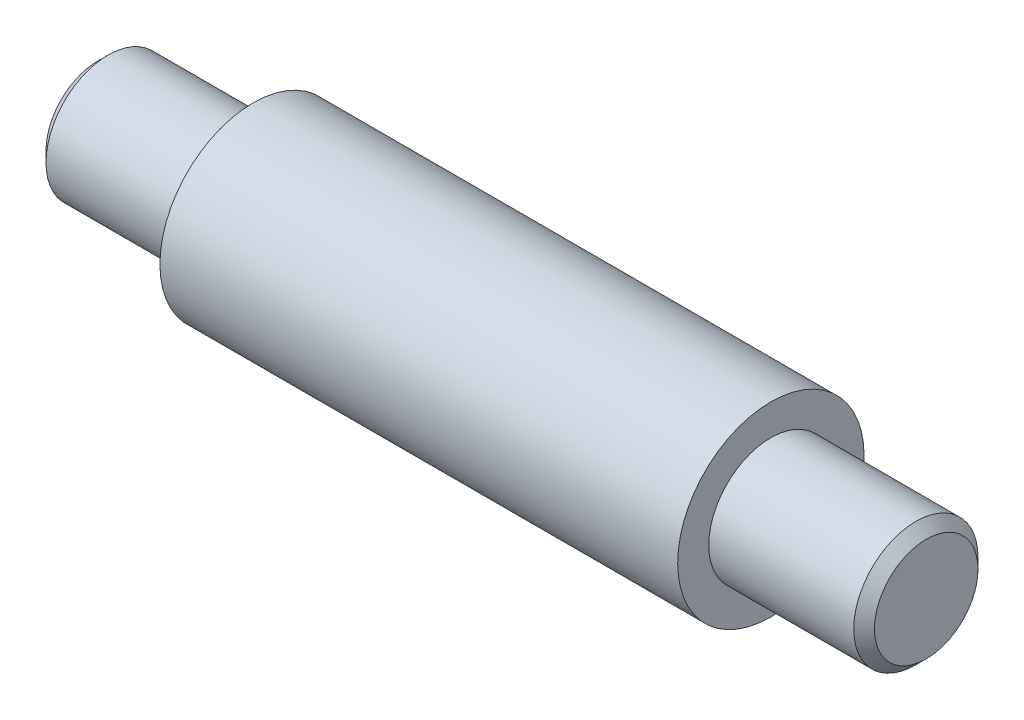
ISO-10303-21;
HEADER;
FILE_DESCRIPTION(('STEP AP214'),'2;1');
FILE_NAME('part.step','',(''),(''),'','','');
FILE_SCHEMA(('AUTOMOTIVE_DESIGN { 1 0 10303 214 1 1 1 1 }'));
ENDSEC;
DATA;
#1=APPLICATION_CONTEXT('core data for automotive mechanical design processes');
#2=APPLICATION_PROTOCOL_DEFINITION('international standard','automotive_design',2000,#1);
#3=PRODUCT_CONTEXT('',#1,'mechanical');
#4=PRODUCT('Part','Part','',(#3));
#5=PRODUCT_RELATED_PRODUCT_CATEGORY('part','',(#4));
#6=PRODUCT_DEFINITION_FORMATION('','',#4);
#7=PRODUCT_DEFINITION_CONTEXT('part definition',#1,'design');
#8=PRODUCT_DEFINITION('design','',#6,#7);
#9=PRODUCT_DEFINITION_SHAPE('','',#8);
#10=(LENGTH_UNIT() NAMED_UNIT(*) SI_UNIT(.MILLI.,.METRE.));
#11=(NAMED_UNIT(*) PLANE_ANGLE_UNIT() SI_UNIT($,.RADIAN.));
#12=(NAMED_UNIT(*) SI_UNIT($,.STERADIAN.) SOLID_ANGLE_UNIT());
#13=UNCERTAINTY_MEASURE_WITH_UNIT(LENGTH_MEASURE(1.E-05),#10,'distance_accuracy_value','');
#14=(GEOMETRIC_REPRESENTATION_CONTEXT(3) GLOBAL_UNCERTAINTY_ASSIGNED_CONTEXT((#13)) GLOBAL_UNIT_ASSIGNED_CONTEXT((#10,
#11,#12)) REPRESENTATION_CONTEXT('',''));
#15=CARTESIAN_POINT('',(0.,0.,0.));
#16=DIRECTION('',(0.,0.,1.));
#17=DIRECTION('',(1.,0.,0.));
#18=AXIS2_PLACEMENT_3D('',#15,#16,#17);
#19=CARTESIAN_POINT('',(-40.,0.,0.));
#20=DIRECTION('',(-1.,0.,0.));
#21=DIRECTION('',(0.,0.,1.));
#22=AXIS2_PLACEMENT_3D('',#19,#20,#21);
#23=PLANE('',#22);
#24=CARTESIAN_POINT('',(-40.,0.,0.));
#25=DIRECTION('',(-1.,0.,0.));
#26=DIRECTION('',(0.,0.,1.));
#27=AXIS2_PLACEMENT_3D('',#24,#25,#26);
#28=CIRCLE('',#27,5.);
#29=CARTESIAN_POINT('',(-40.,0.,5.));
#30=VERTEX_POINT('',#29);
#31=EDGE_CURVE('E51',#30,#30,#28,.T.);
#32=ORIENTED_EDGE('',*,*,#31,.T.);
#33=EDGE_LOOP('',(#32));
#34=FACE_BOUND('',#33,.T.);
#35=ADVANCED_FACE('F43',(#34),#23,.T.);
#36=CARTESIAN_POINT('',(-40.,0.,0.));
#37=DIRECTION('',(-1.,0.,0.));
#38=DIRECTION('',(0.,0.,1.));
#39=AXIS2_PLACEMENT_3D('',#36,#37,#38);
#40=CYLINDRICAL_SURFACE('',#39,6.);
#41=CARTESIAN_POINT('',(-39.,0.,0.));
#42=DIRECTION('',(-1.,0.,0.));
#43=DIRECTION('',(0.,0.,1.));
#44=AXIS2_PLACEMENT_3D('',#41,#42,#43);
#45=CIRCLE('',#44,6.);
#46=CARTESIAN_POINT('',(-39.,0.,6.));
#47=VERTEX_POINT('',#46);
#48=EDGE_CURVE('E10',#47,#47,#45,.F.);
#49=ORIENTED_EDGE('',*,*,#48,.T.);
#50=EDGE_LOOP('',(#49));
#51=FACE_BOUND('',#50,.T.);
#52=CARTESIAN_POINT('',(-25.,0.,0.));
#53=DIRECTION('',(-1.,0.,0.));
#54=DIRECTION('',(0.,0.,1.));
#55=AXIS2_PLACEMENT_3D('',#52,#53,#54);
#56=CIRCLE('',#55,6.);
#57=CARTESIAN_POINT('',(-25.,0.,6.));
#58=VERTEX_POINT('',#57);
#59=EDGE_CURVE('E61',#58,#58,#56,.T.);
#60=ORIENTED_EDGE('',*,*,#59,.T.);
#61=EDGE_LOOP('',(#60));
#62=FACE_BOUND('',#61,.T.);
#63=ADVANCED_FACE('F92',(#51,#62),#40,.T.);
#64=CARTESIAN_POINT('',(-25.,6.,0.));
#65=DIRECTION('',(-1.,0.,0.));
#66=DIRECTION('',(0.,0.,1.));
#67=AXIS2_PLACEMENT_3D('',#64,#65,#66);
#68=PLANE('',#67);
#69=CARTESIAN_POINT('',(-25.,0.,0.));
#70=DIRECTION('',(-1.,0.,0.));
#71=DIRECTION('',(0.,0.,1.));
#72=AXIS2_PLACEMENT_3D('',#69,#70,#71);
#73=CIRCLE('',#72,9.);
#74=CARTESIAN_POINT('',(-25.,0.,9.));
#75=VERTEX_POINT('',#74);
#76=EDGE_CURVE('E70',#75,#75,#73,.T.);
#77=ORIENTED_EDGE('',*,*,#76,.T.);
#78=EDGE_LOOP('',(#77));
#79=FACE_BOUND('',#78,.T.);
#80=ORIENTED_EDGE('',*,*,#59,.F.);
#81=EDGE_LOOP('',(#80));
#82=FACE_BOUND('',#81,.T.);
#83=ADVANCED_FACE('F99',(#79,#82),#68,.T.);
#84=CARTESIAN_POINT('',(-40.,0.,0.));
#85=DIRECTION('',(-1.,0.,0.));
#86=DIRECTION('',(0.,0.,1.));
#87=AXIS2_PLACEMENT_3D('',#84,#85,#86);
#88=CYLINDRICAL_SURFACE('',#87,9.);
#89=CARTESIAN_POINT('',(25.,0.,0.));
#90=DIRECTION('',(-1.,0.,0.));
#91=DIRECTION('',(0.,0.,1.));
#92=AXIS2_PLACEMENT_3D('',#89,#90,#91);
#93=CIRCLE('',#92,9.);
#94=CARTESIAN_POINT('',(25.,0.,9.));
#95=VERTEX_POINT('',#94);
#96=EDGE_CURVE('E68',#95,#95,#93,.T.);
#97=ORIENTED_EDGE('',*,*,#96,.T.);
#98=EDGE_LOOP('',(#97));
#99=FACE_BOUND('',#98,.T.);
#100=ORIENTED_EDGE('',*,*,#76,.F.);
#101=EDGE_LOOP('',(#100));
#102=FACE_BOUND('',#101,.T.);
#103=ADVANCED_FACE('F95',(#99,#102),#88,.T.);
#104=CARTESIAN_POINT('',(25.,9.,0.));
#105=DIRECTION('',(1.,0.,0.));
#106=DIRECTION('',(0.,0.,-1.));
#107=AXIS2_PLACEMENT_3D('',#104,#105,#106);
#108=PLANE('',#107);
#109=CARTESIAN_POINT('',(25.,0.,0.));
#110=DIRECTION('',(-1.,0.,0.));
#111=DIRECTION('',(0.,0.,1.));
#112=AXIS2_PLACEMENT_3D('',#109,#110,#111);
#113=CIRCLE('',#112,6.);
#114=CARTESIAN_POINT('',(25.,0.,6.));
#115=VERTEX_POINT('',#114);
#116=EDGE_CURVE('E71',#115,#115,#113,.T.);
#117=ORIENTED_EDGE('',*,*,#116,.T.);
#118=EDGE_LOOP('',(#117));
#119=FACE_BOUND('',#118,.T.);
#120=ORIENTED_EDGE('',*,*,#96,.F.);
#121=EDGE_LOOP('',(#120));
#122=FACE_BOUND('',#121,.T.);
#123=ADVANCED_FACE('F80',(#119,#122),#108,.T.);
#124=CARTESIAN_POINT('',(-40.,0.,0.));
#125=DIRECTION('',(-1.,0.,0.));
#126=DIRECTION('',(0.,0.,1.));
#127=AXIS2_PLACEMENT_3D('',#124,#125,#126);
#128=CYLINDRICAL_SURFACE('',#127,6.);
#129=CARTESIAN_POINT('',(39.,0.,0.));
#130=DIRECTION('',(1.,0.,0.));
#131=DIRECTION('',(0.,0.,-1.));
#132=AXIS2_PLACEMENT_3D('',#129,#130,#131);
#133=CIRCLE('',#132,6.);
#134=CARTESIAN_POINT('',(39.,0.,-6.));
#135=VERTEX_POINT('',#134);
#136=EDGE_CURVE('E56',#135,#135,#133,.F.);
#137=ORIENTED_EDGE('',*,*,#136,.T.);
#138=EDGE_LOOP('',(#137));
#139=FACE_BOUND('',#138,.T.);
#140=ORIENTED_EDGE('',*,*,#116,.F.);
#141=EDGE_LOOP('',(#140));
#142=FACE_BOUND('',#141,.T.);
#143=ADVANCED_FACE('F78',(#139,#142),#128,.T.);
#144=CARTESIAN_POINT('',(40.,6.,0.));
#145=DIRECTION('',(1.,0.,0.));
#146=DIRECTION('',(0.,0.,-1.));
#147=AXIS2_PLACEMENT_3D('',#144,#145,#146);
#148=PLANE('',#147);
#149=CARTESIAN_POINT('',(40.,0.,0.));
#150=DIRECTION('',(1.,0.,0.));
#151=DIRECTION('',(0.,0.,-1.));
#152=AXIS2_PLACEMENT_3D('',#149,#150,#151);
#153=CIRCLE('',#152,5.);
#154=CARTESIAN_POINT('',(40.,0.,-5.));
#155=VERTEX_POINT('',#154);
#156=EDGE_CURVE('E54',#155,#155,#153,.T.);
#157=ORIENTED_EDGE('',*,*,#156,.T.);
#158=EDGE_LOOP('',(#157));
#159=FACE_BOUND('',#158,.T.);
#160=ADVANCED_FACE('F85',(#159),#148,.T.);
#161=CARTESIAN_POINT('',(39.,0.,0.));
#162=DIRECTION('',(-1.,0.,0.));
#163=DIRECTION('',(0.,0.,1.));
#164=AXIS2_PLACEMENT_3D('',#161,#162,#163);
#165=CONICAL_SURFACE('',#164,6.,0.78539816339746);
#166=ORIENTED_EDGE('',*,*,#156,.F.);
#167=EDGE_LOOP('',(#166));
#168=FACE_BOUND('',#167,.T.);
#169=ORIENTED_EDGE('',*,*,#136,.F.);
#170=EDGE_LOOP('',(#169));
#171=FACE_BOUND('',#170,.T.);
#172=ADVANCED_FACE('F90',(#168,#171),#165,.T.);
#173=CARTESIAN_POINT('',(-40.,0.,0.));
#174=DIRECTION('',(1.,0.,0.));
#175=DIRECTION('',(0.,0.,-1.));
#176=AXIS2_PLACEMENT_3D('',#173,#174,#175);
#177=CONICAL_SURFACE('',#176,5.,0.785398163397446);
#178=ORIENTED_EDGE('',*,*,#48,.F.);
#179=EDGE_LOOP('',(#178));
#180=FACE_BOUND('',#179,.T.);
#181=ORIENTED_EDGE('',*,*,#31,.F.);
#182=EDGE_LOOP('',(#181));
#183=FACE_BOUND('',#182,.T.);
#184=ADVANCED_FACE('F46',(#180,#183),#177,.T.);
#185=CLOSED_SHELL('',(#35,#63,#83,#103,#123,#143,#160,#172,#184));
#186=MANIFOLD_SOLID_BREP('B2',#185);
#187=ADVANCED_BREP_SHAPE_REPRESENTATION('',(#18,#186),#14);
#188=SHAPE_DEFINITION_REPRESENTATION(#9,#187);
ENDSEC;
END-ISO-10303-21;
